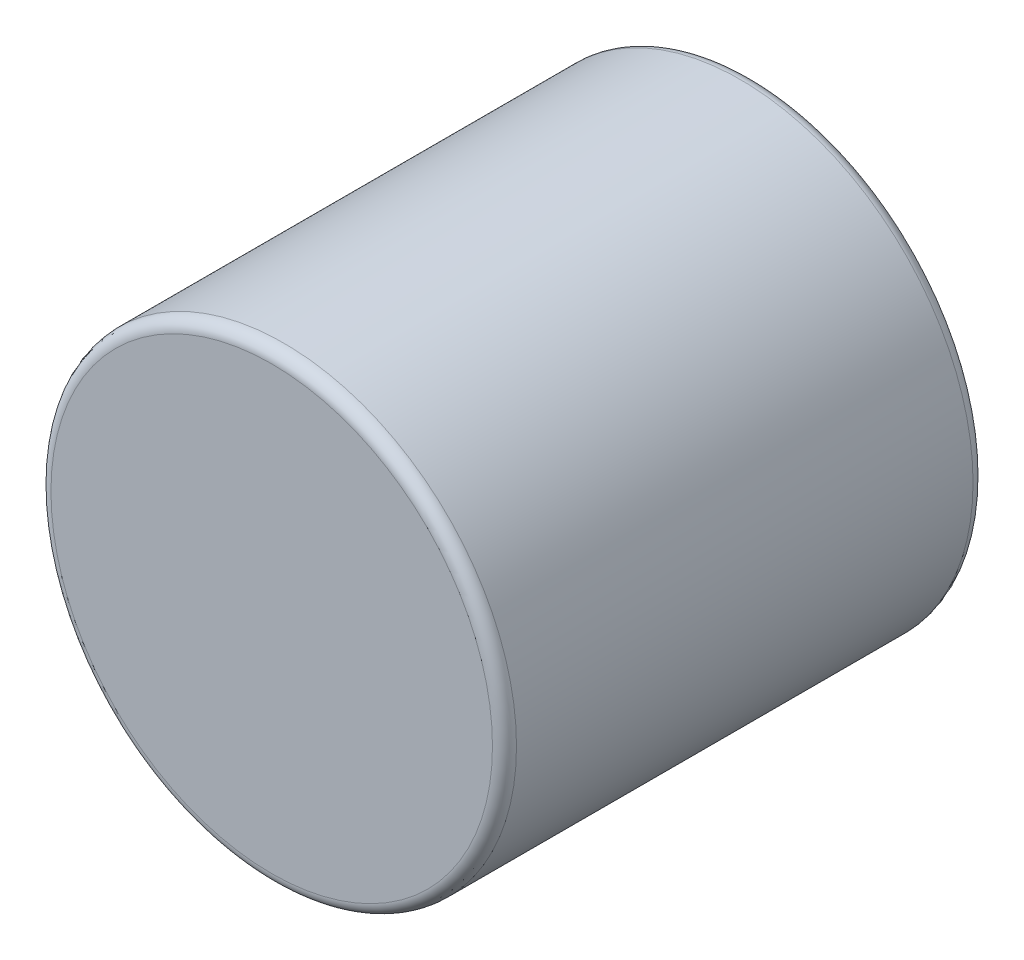
ISO-10303-21;
HEADER;
FILE_DESCRIPTION(('STEP AP214'),'2;1');
FILE_NAME('part.step','',(''),(''),'','','');
FILE_SCHEMA(('AUTOMOTIVE_DESIGN { 1 0 10303 214 1 1 1 1 }'));
ENDSEC;
DATA;
#1=APPLICATION_CONTEXT('core data for automotive mechanical design processes');
#2=APPLICATION_PROTOCOL_DEFINITION('international standard','automotive_design',2000,#1);
#3=PRODUCT_CONTEXT('',#1,'mechanical');
#4=PRODUCT('Part','Part','',(#3));
#5=PRODUCT_RELATED_PRODUCT_CATEGORY('part','',(#4));
#6=PRODUCT_DEFINITION_FORMATION('','',#4);
#7=PRODUCT_DEFINITION_CONTEXT('part definition',#1,'design');
#8=PRODUCT_DEFINITION('design','',#6,#7);
#9=PRODUCT_DEFINITION_SHAPE('','',#8);
#10=(LENGTH_UNIT() NAMED_UNIT(*) SI_UNIT(.MILLI.,.METRE.));
#11=(NAMED_UNIT(*) PLANE_ANGLE_UNIT() SI_UNIT($,.RADIAN.));
#12=(NAMED_UNIT(*) SI_UNIT($,.STERADIAN.) SOLID_ANGLE_UNIT());
#13=UNCERTAINTY_MEASURE_WITH_UNIT(LENGTH_MEASURE(1.E-05),#10,'distance_accuracy_value','');
#14=(GEOMETRIC_REPRESENTATION_CONTEXT(3) GLOBAL_UNCERTAINTY_ASSIGNED_CONTEXT((#13)) GLOBAL_UNIT_ASSIGNED_CONTEXT((#10,
#11,#12)) REPRESENTATION_CONTEXT('',''));
#15=CARTESIAN_POINT('',(0.,0.,0.));
#16=DIRECTION('',(0.,0.,1.));
#17=DIRECTION('',(1.,0.,0.));
#18=AXIS2_PLACEMENT_3D('',#15,#16,#17);
#19=CARTESIAN_POINT('',(0.,0.,101.6));
#20=DIRECTION('',(0.,0.,-1.));
#21=DIRECTION('',(-1.,0.,0.));
#22=AXIS2_PLACEMENT_3D('',#19,#20,#21);
#23=CYLINDRICAL_SURFACE('',#22,49.2125);
#24=CARTESIAN_POINT('',(0.,0.,2.54));
#25=DIRECTION('',(0.,0.,1.));
#26=DIRECTION('',(1.,0.,0.));
#27=AXIS2_PLACEMENT_3D('',#24,#25,#26);
#28=CIRCLE('',#27,49.2125);
#29=CARTESIAN_POINT('',(49.2125,0.,2.54));
#30=VERTEX_POINT('',#29);
#31=EDGE_CURVE('E49',#30,#30,#28,.T.);
#32=ORIENTED_EDGE('',*,*,#31,.T.);
#33=EDGE_LOOP('',(#32));
#34=FACE_BOUND('',#33,.T.);
#35=CARTESIAN_POINT('',(0.,0.,99.06));
#36=DIRECTION('',(0.,0.,1.));
#37=DIRECTION('',(1.,0.,0.));
#38=AXIS2_PLACEMENT_3D('',#35,#36,#37);
#39=CIRCLE('',#38,49.2125);
#40=CARTESIAN_POINT('',(49.2125,0.,99.06));
#41=VERTEX_POINT('',#40);
#42=EDGE_CURVE('E53',#41,#41,#39,.F.);
#43=ORIENTED_EDGE('',*,*,#42,.T.);
#44=EDGE_LOOP('',(#43));
#45=FACE_BOUND('',#44,.T.);
#46=ADVANCED_FACE('F38',(#34,#45),#23,.T.);
#47=CARTESIAN_POINT('',(0.,0.,101.6));
#48=DIRECTION('',(0.,0.,1.));
#49=DIRECTION('',(1.,0.,0.));
#50=AXIS2_PLACEMENT_3D('',#47,#48,#49);
#51=PLANE('',#50);
#52=CARTESIAN_POINT('',(0.,0.,101.6));
#53=DIRECTION('',(0.,0.,1.));
#54=DIRECTION('',(1.,0.,0.));
#55=AXIS2_PLACEMENT_3D('',#52,#53,#54);
#56=CIRCLE('',#55,46.6725);
#57=CARTESIAN_POINT('',(46.6725,0.,101.6));
#58=VERTEX_POINT('',#57);
#59=EDGE_CURVE('E10',#58,#58,#56,.T.);
#60=ORIENTED_EDGE('',*,*,#59,.T.);
#61=EDGE_LOOP('',(#60));
#62=FACE_BOUND('',#61,.T.);
#63=ADVANCED_FACE('F69',(#62),#51,.T.);
#64=CARTESIAN_POINT('',(0.,0.,0.));
#65=DIRECTION('',(0.,0.,1.));
#66=DIRECTION('',(1.,0.,0.));
#67=AXIS2_PLACEMENT_3D('',#64,#65,#66);
#68=PLANE('',#67);
#69=CARTESIAN_POINT('',(0.,0.,0.));
#70=DIRECTION('',(0.,0.,1.));
#71=DIRECTION('',(1.,0.,0.));
#72=AXIS2_PLACEMENT_3D('',#69,#70,#71);
#73=CIRCLE('',#72,46.6725);
#74=CARTESIAN_POINT('',(46.6725,0.,0.));
#75=VERTEX_POINT('',#74);
#76=EDGE_CURVE('E45',#75,#75,#73,.F.);
#77=ORIENTED_EDGE('',*,*,#76,.T.);
#78=EDGE_LOOP('',(#77));
#79=FACE_BOUND('',#78,.T.);
#80=ADVANCED_FACE('F66',(#79),#68,.F.);
#81=CARTESIAN_POINT('',(0.,0.,2.54));
#82=DIRECTION('',(0.,0.,1.));
#83=DIRECTION('',(1.,0.,0.));
#84=AXIS2_PLACEMENT_3D('',#81,#82,#83);
#85=TOROIDAL_SURFACE('',#84,46.6725,2.54);
#86=ORIENTED_EDGE('',*,*,#76,.F.);
#87=EDGE_LOOP('',(#86));
#88=FACE_BOUND('',#87,.T.);
#89=ORIENTED_EDGE('',*,*,#31,.F.);
#90=EDGE_LOOP('',(#89));
#91=FACE_BOUND('',#90,.T.);
#92=ADVANCED_FACE('F62',(#88,#91),#85,.T.);
#93=CARTESIAN_POINT('',(0.,0.,99.06));
#94=DIRECTION('',(0.,0.,1.));
#95=DIRECTION('',(1.,0.,0.));
#96=AXIS2_PLACEMENT_3D('',#93,#94,#95);
#97=TOROIDAL_SURFACE('',#96,46.6725,2.54);
#98=ORIENTED_EDGE('',*,*,#42,.F.);
#99=EDGE_LOOP('',(#98));
#100=FACE_BOUND('',#99,.T.);
#101=ORIENTED_EDGE('',*,*,#59,.F.);
#102=EDGE_LOOP('',(#101));
#103=FACE_BOUND('',#102,.T.);
#104=ADVANCED_FACE('F40',(#100,#103),#97,.T.);
#105=CLOSED_SHELL('',(#46,#63,#80,#92,#104));
#106=MANIFOLD_SOLID_BREP('B2',#105);
#107=ADVANCED_BREP_SHAPE_REPRESENTATION('',(#18,#106),#14);
#108=SHAPE_DEFINITION_REPRESENTATION(#9,#107);
ENDSEC;
END-ISO-10303-21;
